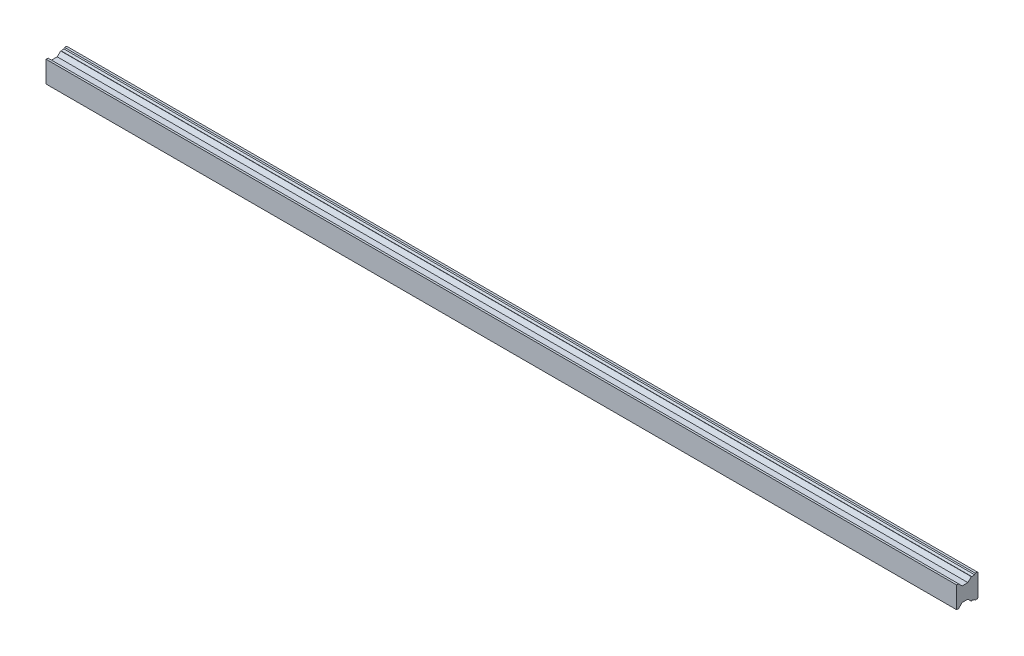
ISO-10303-21;
HEADER;
FILE_DESCRIPTION(('STEP AP214'),'2;1');
FILE_NAME('part.step','',(''),(''),'','','');
FILE_SCHEMA(('AUTOMOTIVE_DESIGN { 1 0 10303 214 1 1 1 1 }'));
ENDSEC;
DATA;
#1=APPLICATION_CONTEXT('core data for automotive mechanical design processes');
#2=APPLICATION_PROTOCOL_DEFINITION('international standard','automotive_design',2000,#1);
#3=PRODUCT_CONTEXT('',#1,'mechanical');
#4=PRODUCT('Part','Part','',(#3));
#5=PRODUCT_RELATED_PRODUCT_CATEGORY('part','',(#4));
#6=PRODUCT_DEFINITION_FORMATION('','',#4);
#7=PRODUCT_DEFINITION_CONTEXT('part definition',#1,'design');
#8=PRODUCT_DEFINITION('design','',#6,#7);
#9=PRODUCT_DEFINITION_SHAPE('','',#8);
#10=(LENGTH_UNIT() NAMED_UNIT(*) SI_UNIT(.MILLI.,.METRE.));
#11=(NAMED_UNIT(*) PLANE_ANGLE_UNIT() SI_UNIT($,.RADIAN.));
#12=(NAMED_UNIT(*) SI_UNIT($,.STERADIAN.) SOLID_ANGLE_UNIT());
#13=UNCERTAINTY_MEASURE_WITH_UNIT(LENGTH_MEASURE(1.E-05),#10,'distance_accuracy_value','');
#14=(GEOMETRIC_REPRESENTATION_CONTEXT(3) GLOBAL_UNCERTAINTY_ASSIGNED_CONTEXT((#13)) GLOBAL_UNIT_ASSIGNED_CONTEXT((#10,
#11,#12)) REPRESENTATION_CONTEXT('',''));
#15=CARTESIAN_POINT('',(0.,0.,0.));
#16=DIRECTION('',(0.,0.,1.));
#17=DIRECTION('',(1.,0.,0.));
#18=AXIS2_PLACEMENT_3D('',#15,#16,#17);
#19=CARTESIAN_POINT('',(702.99957441218,902.9999820789,490.4997838149));
#20=DIRECTION('',(-1.,0.,0.));
#21=DIRECTION('',(0.,0.,1.));
#22=AXIS2_PLACEMENT_3D('',#19,#20,#21);
#23=PLANE('',#22);
#24=DIRECTION('',(0.,-0.707106781187552,0.707106781185543));
#25=VECTOR('',#24,1.);
#26=CARTESIAN_POINT('',(702.99957441218,903.9999820789,490.4997838149));
#27=LINE('',#26,#25);
#28=CARTESIAN_POINT('',(702.99957441218,903.9999820789,490.4997838149));
#29=VERTEX_POINT('',#28);
#30=CARTESIAN_POINT('',(702.99957441218,902.999982078899,491.499783814899));
#31=VERTEX_POINT('',#30);
#32=EDGE_CURVE('E277',#29,#31,#27,.T.);
#33=ORIENTED_EDGE('',*,*,#32,.F.);
#34=DIRECTION('',(0.,-1.,0.));
#35=VECTOR('',#34,1.);
#36=CARTESIAN_POINT('',(702.99957441218,935.9999820789,490.4997838149));
#37=LINE('',#36,#35);
#38=CARTESIAN_POINT('',(702.99957441218,935.999982078899,490.4997838149));
#39=VERTEX_POINT('',#38);
#40=EDGE_CURVE('E349',#39,#29,#37,.T.);
#41=ORIENTED_EDGE('',*,*,#40,.F.);
#42=DIRECTION('',(0.,-0.707106781187552,-0.707106781185543));
#43=VECTOR('',#42,1.);
#44=CARTESIAN_POINT('',(702.99957441218,936.9999820789,491.4997838149));
#45=LINE('',#44,#43);
#46=CARTESIAN_POINT('',(702.99957441218,936.999982078917,491.499783814917));
#47=VERTEX_POINT('',#46);
#48=EDGE_CURVE('E345',#47,#39,#45,.T.);
#49=ORIENTED_EDGE('',*,*,#48,.F.);
#50=DIRECTION('',(0.,0.,1.));
#51=VECTOR('',#50,1.);
#52=CARTESIAN_POINT('',(702.99957441218,936.999982078935,490.4997838149));
#53=LINE('',#52,#51);
#54=CARTESIAN_POINT('',(702.99957441218,936.999982078935,494.499783814904));
#55=VERTEX_POINT('',#54);
#56=EDGE_CURVE('E340',#47,#55,#53,.T.);
#57=ORIENTED_EDGE('',*,*,#56,.T.);
#58=DIRECTION('',(0.,-0.707106781186548,0.707106781186548));
#59=VECTOR('',#58,1.);
#60=CARTESIAN_POINT('',(702.99957441218,936.386982078934,495.112783814905));
#61=LINE('',#60,#59);
#62=CARTESIAN_POINT('',(702.99957441218,935.773982078907,495.725783814932));
#63=VERTEX_POINT('',#62);
#64=EDGE_CURVE('E338',#63,#55,#61,.F.);
#65=ORIENTED_EDGE('',*,*,#64,.F.);
#66=DIRECTION('',(0.,0.258778081910201,-0.965936801412431));
#67=VECTOR('',#66,1.);
#68=CARTESIAN_POINT('',(702.99957441218,934.8499820789,499.1747838149));
#69=LINE('',#68,#67);
#70=CARTESIAN_POINT('',(702.99957441218,934.849982078902,499.174783814891));
#71=VERTEX_POINT('',#70);
#72=EDGE_CURVE('E333',#71,#63,#69,.T.);
#73=ORIENTED_EDGE('',*,*,#72,.F.);
#74=DIRECTION('',(0.,-0.707106781186548,-0.707106781186548));
#75=VECTOR('',#74,1.);
#76=CARTESIAN_POINT('',(702.99957441218,935.499982078933,499.82478381491));
#77=LINE('',#76,#75);
#78=CARTESIAN_POINT('',(702.99957441218,935.499982078933,499.82478381491));
#79=VERTEX_POINT('',#78);
#80=EDGE_CURVE('E328',#71,#79,#77,.F.);
#81=ORIENTED_EDGE('',*,*,#80,.T.);
#82=DIRECTION('',(0.,0.,1.));
#83=VECTOR('',#82,1.);
#84=CARTESIAN_POINT('',(702.99957441218,935.499982078933,500.04528381491));
#85=LINE('',#84,#83);
#86=CARTESIAN_POINT('',(702.99957441218,935.499982078933,500.265783814891));
#87=VERTEX_POINT('',#86);
#88=EDGE_CURVE('E326',#87,#79,#85,.F.);
#89=ORIENTED_EDGE('',*,*,#88,.F.);
#90=DIRECTION('',(0.,0.707106781187552,-0.707106781185543));
#91=VECTOR('',#90,1.);
#92=CARTESIAN_POINT('',(702.99957441218,930.4999820789,505.2657838149));
#93=LINE('',#92,#91);
#94=CARTESIAN_POINT('',(702.99957441218,930.499982078914,505.265783814886));
#95=VERTEX_POINT('',#94);
#96=EDGE_CURVE('E323',#95,#87,#93,.T.);
#97=ORIENTED_EDGE('',*,*,#96,.F.);
#98=DIRECTION('',(0.,0.,1.));
#99=VECTOR('',#98,1.);
#100=CARTESIAN_POINT('',(702.99957441218,930.499982078928,509.420283814919));
#101=LINE('',#100,#99);
#102=CARTESIAN_POINT('',(702.99957441218,930.499982078928,513.574783814922));
#103=VERTEX_POINT('',#102);
#104=EDGE_CURVE('E320',#103,#95,#101,.F.);
#105=ORIENTED_EDGE('',*,*,#104,.F.);
#106=DIRECTION('',(0.,-0.707106781187552,-0.707106781185543));
#107=VECTOR('',#106,1.);
#108=CARTESIAN_POINT('',(702.99957441218,935.4999820789,518.5747838149));
#109=LINE('',#108,#107);
#110=CARTESIAN_POINT('',(702.99957441218,935.4999820789,518.5747838149));
#111=VERTEX_POINT('',#110);
#112=EDGE_CURVE('E317',#111,#103,#109,.T.);
#113=ORIENTED_EDGE('',*,*,#112,.F.);
#114=DIRECTION('',(0.,-0.0590702266116563,-0.998253829608506));
#115=VECTOR('',#114,1.);
#116=CARTESIAN_POINT('',(702.99957441218,935.6789820789,521.5997838149));
#117=LINE('',#116,#115);
#118=CARTESIAN_POINT('',(702.99957441218,935.6789820789,521.5997838149));
#119=VERTEX_POINT('',#118);
#120=EDGE_CURVE('E314',#119,#111,#117,.T.);
#121=ORIENTED_EDGE('',*,*,#120,.F.);
#122=DIRECTION('',(0.,1.,0.));
#123=VECTOR('',#122,1.);
#124=CARTESIAN_POINT('',(702.99957441218,904.3209820789,521.5997838149));
#125=LINE('',#124,#123);
#126=CARTESIAN_POINT('',(702.99957441218,904.3209820789,521.5997838149));
#127=VERTEX_POINT('',#126);
#128=EDGE_CURVE('E311',#127,#119,#125,.T.);
#129=ORIENTED_EDGE('',*,*,#128,.F.);
#130=DIRECTION('',(0.,-0.0590702266116561,0.998253829608506));
#131=VECTOR('',#130,1.);
#132=CARTESIAN_POINT('',(702.99957441218,904.4999820789,518.5747838149));
#133=LINE('',#132,#131);
#134=CARTESIAN_POINT('',(702.99957441218,904.4999820789,518.574783814893));
#135=VERTEX_POINT('',#134);
#136=EDGE_CURVE('E308',#135,#127,#133,.T.);
#137=ORIENTED_EDGE('',*,*,#136,.F.);
#138=DIRECTION('',(0.,-0.707106781187552,0.707106781185543));
#139=VECTOR('',#138,1.);
#140=CARTESIAN_POINT('',(702.99957441218,909.4999820789,513.5747838149));
#141=LINE('',#140,#139);
#142=CARTESIAN_POINT('',(702.99957441218,909.4999820789,513.5747838149));
#143=VERTEX_POINT('',#142);
#144=EDGE_CURVE('E305',#143,#135,#141,.T.);
#145=ORIENTED_EDGE('',*,*,#144,.F.);
#146=DIRECTION('',(0.,0.,1.));
#147=VECTOR('',#146,1.);
#148=CARTESIAN_POINT('',(702.99957441218,909.4999820789,505.2657838149));
#149=LINE('',#148,#147);
#150=CARTESIAN_POINT('',(702.99957441218,909.4999820789,505.265783814893));
#151=VERTEX_POINT('',#150);
#152=EDGE_CURVE('E302',#151,#143,#149,.T.);
#153=ORIENTED_EDGE('',*,*,#152,.F.);
#154=DIRECTION('',(0.,0.707106781187552,0.707106781185543));
#155=VECTOR('',#154,1.);
#156=CARTESIAN_POINT('',(702.99957441218,904.4999820789,500.2657838149));
#157=LINE('',#156,#155);
#158=CARTESIAN_POINT('',(702.99957441218,904.499982078901,500.265783814901));
#159=VERTEX_POINT('',#158);
#160=EDGE_CURVE('E297',#159,#151,#157,.T.);
#161=ORIENTED_EDGE('',*,*,#160,.F.);
#162=DIRECTION('',(0.,0.,1.));
#163=VECTOR('',#162,1.);
#164=CARTESIAN_POINT('',(702.99957441218,904.499982078902,500.04528381491));
#165=LINE('',#164,#163);
#166=CARTESIAN_POINT('',(702.99957441218,904.499982078901,499.82478381491));
#167=VERTEX_POINT('',#166);
#168=EDGE_CURVE('E293',#167,#159,#165,.T.);
#169=ORIENTED_EDGE('',*,*,#168,.F.);
#170=DIRECTION('',(0.,-0.707106781186548,0.707106781186548));
#171=VECTOR('',#170,1.);
#172=CARTESIAN_POINT('',(702.99957441218,905.149982078902,499.174783814909));
#173=LINE('',#172,#171);
#174=CARTESIAN_POINT('',(702.99957441218,905.149982078905,499.174783814905));
#175=VERTEX_POINT('',#174);
#176=EDGE_CURVE('E189',#167,#175,#173,.F.);
#177=ORIENTED_EDGE('',*,*,#176,.T.);
#178=DIRECTION('',(0.,0.258778081910201,0.965936801412431));
#179=VECTOR('',#178,1.);
#180=CARTESIAN_POINT('',(702.99957441218,904.2259820789,495.7257838149));
#181=LINE('',#180,#179);
#182=CARTESIAN_POINT('',(702.99957441218,904.225982078901,495.725783814903));
#183=VERTEX_POINT('',#182);
#184=EDGE_CURVE('E287',#183,#175,#181,.T.);
#185=ORIENTED_EDGE('',*,*,#184,.F.);
#186=DIRECTION('',(0.,-0.707106781186548,-0.707106781186548));
#187=VECTOR('',#186,1.);
#188=CARTESIAN_POINT('',(702.99957441218,903.612982078901,495.112783814905));
#189=LINE('',#188,#187);
#190=CARTESIAN_POINT('',(702.99957441218,902.9999820789,494.499783814904));
#191=VERTEX_POINT('',#190);
#192=EDGE_CURVE('E282',#191,#183,#189,.F.);
#193=ORIENTED_EDGE('',*,*,#192,.F.);
#194=DIRECTION('',(0.,0.,1.));
#195=VECTOR('',#194,1.);
#196=CARTESIAN_POINT('',(702.99957441218,902.9999820789,490.4997838149));
#197=LINE('',#196,#195);
#198=EDGE_CURVE('E279',#191,#31,#197,.F.);
#199=ORIENTED_EDGE('',*,*,#198,.T.);
#200=EDGE_LOOP('',(#33,#41,#49,#57,#65,#73,#81,#89,#97,#105,#113,#121,#129,#137,#145,#153,#161,
#169,#177,#185,#193,#199));
#201=FACE_BOUND('',#200,.T.);
#202=ADVANCED_FACE('F17',(#201),#23,.F.);
#203=CARTESIAN_POINT('',(30.99957441218,903.612982078901,495.112783814905));
#204=DIRECTION('',(0.,-0.707106781186548,0.707106781186548));
#205=DIRECTION('',(0.,-0.707106781186548,-0.707106781186548));
#206=AXIS2_PLACEMENT_3D('',#203,#204,#205);
#207=PLANE('',#206);
#208=DIRECTION('',(1.,0.,0.));
#209=VECTOR('',#208,1.);
#210=CARTESIAN_POINT('',(30.99957441218,902.9999820789,494.499783814904));
#211=LINE('',#210,#209);
#212=CARTESIAN_POINT('',(-625.00042558782,902.9999820789,494.499783814904));
#213=VERTEX_POINT('',#212);
#214=CARTESIAN_POINT('',(686.99957441218,902.9999820789,494.499783814904));
#215=VERTEX_POINT('',#214);
#216=EDGE_CURVE('E458',#213,#215,#211,.T.);
#217=ORIENTED_EDGE('',*,*,#216,.T.);
#218=CARTESIAN_POINT('',(686.999574412181,902.9999820789,494.499783814904));
#219=DIRECTION('',(1.,0.,0.));
#220=VECTOR('',#219,1.);
#221=LINE('',#218,#220);
#222=EDGE_CURVE('E194',#215,#191,#221,.T.);
#223=ORIENTED_EDGE('',*,*,#222,.T.);
#224=ORIENTED_EDGE('',*,*,#192,.T.);
#225=DIRECTION('',(-1.,0.,0.));
#226=VECTOR('',#225,1.);
#227=CARTESIAN_POINT('',(686.99957441218,904.2259820789,495.7257838149));
#228=LINE('',#227,#226);
#229=CARTESIAN_POINT('',(-625.00042558782,904.2259820789,495.725783814903));
#230=VERTEX_POINT('',#229);
#231=EDGE_CURVE('E206',#230,#183,#228,.F.);
#232=ORIENTED_EDGE('',*,*,#231,.F.);
#233=DIRECTION('',(0.,0.707106781186548,0.707106781186548));
#234=VECTOR('',#233,1.);
#235=CARTESIAN_POINT('',(-625.00042558782,902.9999820789,494.499783814904));
#236=LINE('',#235,#234);
#237=EDGE_CURVE('E260',#213,#230,#236,.T.);
#238=ORIENTED_EDGE('',*,*,#237,.F.);
#239=EDGE_LOOP('',(#217,#223,#224,#232,#238));
#240=FACE_BOUND('',#239,.T.);
#241=ADVANCED_FACE('F433',(#240),#207,.T.);
#242=CARTESIAN_POINT('',(686.99957441218,904.2259820789,495.7257838149));
#243=DIRECTION('',(0.,-0.965936801412431,0.258778081910201));
#244=DIRECTION('',(0.,0.258778081910201,0.965936801412431));
#245=AXIS2_PLACEMENT_3D('',#242,#243,#244);
#246=PLANE('',#245);
#247=ORIENTED_EDGE('',*,*,#231,.T.);
#248=ORIENTED_EDGE('',*,*,#184,.T.);
#249=DIRECTION('',(-1.,0.,0.));
#250=VECTOR('',#249,1.);
#251=CARTESIAN_POINT('',(686.99957441218,905.149982078904,499.174783814904));
#252=LINE('',#251,#250);
#253=CARTESIAN_POINT('',(-625.00042558782,905.149982078904,499.174783814907));
#254=VERTEX_POINT('',#253);
#255=EDGE_CURVE('E202',#175,#254,#252,.T.);
#256=ORIENTED_EDGE('',*,*,#255,.T.);
#257=DIRECTION('',(0.,0.258778081909355,0.965936801412657));
#258=VECTOR('',#257,1.);
#259=CARTESIAN_POINT('',(-625.00042558782,904.225982078901,495.725783814905));
#260=LINE('',#259,#258);
#261=EDGE_CURVE('E256',#230,#254,#260,.T.);
#262=ORIENTED_EDGE('',*,*,#261,.F.);
#263=EDGE_LOOP('',(#247,#248,#256,#262));
#264=FACE_BOUND('',#263,.T.);
#265=ADVANCED_FACE('F432',(#264),#246,.T.);
#266=CARTESIAN_POINT('',(30.99957441218,904.824982078902,499.499783814909));
#267=DIRECTION('',(0.,0.707106781186548,0.707106781186548));
#268=DIRECTION('',(0.,-0.707106781186548,0.707106781186548));
#269=AXIS2_PLACEMENT_3D('',#266,#267,#268);
#270=PLANE('',#269);
#271=DIRECTION('',(0.,-0.707106781186548,0.707106781186548));
#272=VECTOR('',#271,1.);
#273=CARTESIAN_POINT('',(-625.00042558782,905.149982078902,499.174783814909));
#274=LINE('',#273,#272);
#275=CARTESIAN_POINT('',(-625.00042558782,904.499982078902,499.82478381491));
#276=VERTEX_POINT('',#275);
#277=EDGE_CURVE('E259',#254,#276,#274,.T.);
#278=ORIENTED_EDGE('',*,*,#277,.F.);
#279=ORIENTED_EDGE('',*,*,#255,.F.);
#280=ORIENTED_EDGE('',*,*,#176,.F.);
#281=CARTESIAN_POINT('',(686.99957441218,904.499982078902,499.82478381491));
#282=DIRECTION('',(1.,0.,0.));
#283=VECTOR('',#282,1.);
#284=LINE('',#281,#283);
#285=CARTESIAN_POINT('',(686.99957441218,904.499982078901,499.82478381491));
#286=VERTEX_POINT('',#285);
#287=EDGE_CURVE('E181',#286,#167,#284,.T.);
#288=ORIENTED_EDGE('',*,*,#287,.F.);
#289=DIRECTION('',(1.,0.,0.));
#290=VECTOR('',#289,1.);
#291=CARTESIAN_POINT('',(30.99957441218,904.499982078902,499.82478381491));
#292=LINE('',#291,#290);
#293=EDGE_CURVE('E186',#276,#286,#292,.T.);
#294=ORIENTED_EDGE('',*,*,#293,.F.);
#295=EDGE_LOOP('',(#278,#279,#280,#288,#294));
#296=FACE_BOUND('',#295,.T.);
#297=ADVANCED_FACE('F185',(#296),#270,.F.);
#298=CARTESIAN_POINT('',(30.99957441218,904.499982078902,500.04528381491));
#299=DIRECTION('',(0.,-1.,0.));
#300=DIRECTION('',(1.,0.,0.));
#301=AXIS2_PLACEMENT_3D('',#298,#299,#300);
#302=PLANE('',#301);
#303=ORIENTED_EDGE('',*,*,#293,.T.);
#304=ORIENTED_EDGE('',*,*,#287,.T.);
#305=ORIENTED_EDGE('',*,*,#168,.T.);
#306=DIRECTION('',(-1.,0.,0.));
#307=VECTOR('',#306,1.);
#308=CARTESIAN_POINT('',(686.99957441218,904.4999820789,500.2657838149));
#309=LINE('',#308,#307);
#310=CARTESIAN_POINT('',(-625.00042558782,904.499982078901,500.265783814905));
#311=VERTEX_POINT('',#310);
#312=EDGE_CURVE('E201',#311,#159,#309,.F.);
#313=ORIENTED_EDGE('',*,*,#312,.F.);
#314=DIRECTION('',(0.,0.,1.));
#315=VECTOR('',#314,1.);
#316=CARTESIAN_POINT('',(-625.00042558782,904.499982078902,490.4997838149));
#317=LINE('',#316,#315);
#318=EDGE_CURVE('E199',#276,#311,#317,.T.);
#319=ORIENTED_EDGE('',*,*,#318,.F.);
#320=EDGE_LOOP('',(#303,#304,#305,#313,#319));
#321=FACE_BOUND('',#320,.T.);
#322=ADVANCED_FACE('F197',(#321),#302,.T.);
#323=CARTESIAN_POINT('',(686.99957441218,904.4999820789,500.2657838149));
#324=DIRECTION('',(0.,-0.707106781185543,0.707106781187552));
#325=DIRECTION('',(0.,0.707106781187552,0.707106781185543));
#326=AXIS2_PLACEMENT_3D('',#323,#324,#325);
#327=PLANE('',#326);
#328=ORIENTED_EDGE('',*,*,#312,.T.);
#329=ORIENTED_EDGE('',*,*,#160,.T.);
#330=DIRECTION('',(-1.,0.,0.));
#331=VECTOR('',#330,1.);
#332=CARTESIAN_POINT('',(686.99957441218,909.4999820789,505.2657838149));
#333=LINE('',#332,#331);
#334=CARTESIAN_POINT('',(-625.00042558782,909.499982078902,505.265783814908));
#335=VERTEX_POINT('',#334);
#336=EDGE_CURVE('E204',#335,#151,#333,.F.);
#337=ORIENTED_EDGE('',*,*,#336,.F.);
#338=DIRECTION('',(0.,0.707106781186556,0.70710678118654));
#339=VECTOR('',#338,1.);
#340=CARTESIAN_POINT('',(-625.00042558782,904.499982078902,500.26578381491));
#341=LINE('',#340,#339);
#342=EDGE_CURVE('E253',#311,#335,#341,.T.);
#343=ORIENTED_EDGE('',*,*,#342,.F.);
#344=EDGE_LOOP('',(#328,#329,#337,#343));
#345=FACE_BOUND('',#344,.T.);
#346=ADVANCED_FACE('F421',(#345),#327,.T.);
#347=CARTESIAN_POINT('',(686.99957441218,909.4999820789,505.2657838149));
#348=DIRECTION('',(0.,-1.,0.));
#349=DIRECTION('',(0.,0.,1.));
#350=AXIS2_PLACEMENT_3D('',#347,#348,#349);
#351=PLANE('',#350);
#352=ORIENTED_EDGE('',*,*,#336,.T.);
#353=ORIENTED_EDGE('',*,*,#152,.T.);
#354=DIRECTION('',(-1.,0.,0.));
#355=VECTOR('',#354,1.);
#356=CARTESIAN_POINT('',(686.99957441218,909.4999820789,513.5747838149));
#357=LINE('',#356,#355);
#358=CARTESIAN_POINT('',(-625.00042558782,909.499982078905,513.574783814912));
#359=VERTEX_POINT('',#358);
#360=EDGE_CURVE('E274',#359,#143,#357,.F.);
#361=ORIENTED_EDGE('',*,*,#360,.F.);
#362=DIRECTION('',(0.,0.,1.));
#363=VECTOR('',#362,1.);
#364=CARTESIAN_POINT('',(-625.00042558782,909.499982078907,490.4997838149));
#365=LINE('',#364,#363);
#366=EDGE_CURVE('E250',#335,#359,#365,.T.);
#367=ORIENTED_EDGE('',*,*,#366,.F.);
#368=EDGE_LOOP('',(#352,#353,#361,#367));
#369=FACE_BOUND('',#368,.T.);
#370=ADVANCED_FACE('F673',(#369),#351,.T.);
#371=CARTESIAN_POINT('',(686.99957441218,909.4999820789,513.5747838149));
#372=DIRECTION('',(0.,-0.707106781185543,-0.707106781187552));
#373=DIRECTION('',(0.,-0.707106781187552,0.707106781185543));
#374=AXIS2_PLACEMENT_3D('',#371,#372,#373);
#375=PLANE('',#374);
#376=ORIENTED_EDGE('',*,*,#360,.T.);
#377=ORIENTED_EDGE('',*,*,#144,.T.);
#378=DIRECTION('',(-1.,0.,0.));
#379=VECTOR('',#378,1.);
#380=CARTESIAN_POINT('',(686.99957441218,904.4999820789,518.5747838149));
#381=LINE('',#380,#379);
#382=CARTESIAN_POINT('',(-625.00042558782,904.499982078902,518.574783814915));
#383=VERTEX_POINT('',#382);
#384=EDGE_CURVE('E272',#383,#135,#381,.F.);
#385=ORIENTED_EDGE('',*,*,#384,.F.);
#386=DIRECTION('',(0.,-0.70710678118654,0.707106781186556));
#387=VECTOR('',#386,1.);
#388=CARTESIAN_POINT('',(-625.00042558782,909.499982078907,513.574783814924));
#389=LINE('',#388,#387);
#390=EDGE_CURVE('E247',#359,#383,#389,.T.);
#391=ORIENTED_EDGE('',*,*,#390,.F.);
#392=EDGE_LOOP('',(#376,#377,#385,#391));
#393=FACE_BOUND('',#392,.T.);
#394=ADVANCED_FACE('F663',(#393),#375,.T.);
#395=CARTESIAN_POINT('',(686.99957441218,904.4999820789,518.5747838149));
#396=DIRECTION('',(0.,-0.998253829608506,-0.0590702266116561));
#397=DIRECTION('',(0.,-0.0590702266116561,0.998253829608506));
#398=AXIS2_PLACEMENT_3D('',#395,#396,#397);
#399=PLANE('',#398);
#400=ORIENTED_EDGE('',*,*,#384,.T.);
#401=ORIENTED_EDGE('',*,*,#136,.T.);
#402=DIRECTION('',(-1.,0.,0.));
#403=VECTOR('',#402,1.);
#404=CARTESIAN_POINT('',(686.99957441218,904.3209820789,521.5997838149));
#405=LINE('',#404,#403);
#406=CARTESIAN_POINT('',(-625.00042558782,904.320982078902,521.599783814916));
#407=VERTEX_POINT('',#406);
#408=EDGE_CURVE('E270',#407,#127,#405,.F.);
#409=ORIENTED_EDGE('',*,*,#408,.F.);
#410=DIRECTION('',(0.,-0.0590702266115375,0.998253829608513));
#411=VECTOR('',#410,1.);
#412=CARTESIAN_POINT('',(-625.00042558782,904.499982078902,518.574783814929));
#413=LINE('',#412,#411);
#414=EDGE_CURVE('E244',#383,#407,#413,.T.);
#415=ORIENTED_EDGE('',*,*,#414,.F.);
#416=EDGE_LOOP('',(#400,#401,#409,#415));
#417=FACE_BOUND('',#416,.T.);
#418=ADVANCED_FACE('F653',(#417),#399,.T.);
#419=CARTESIAN_POINT('',(686.99957441218,904.3209820789,521.5997838149));
#420=DIRECTION('',(0.,0.,1.));
#421=DIRECTION('',(0.,1.,0.));
#422=AXIS2_PLACEMENT_3D('',#419,#420,#421);
#423=PLANE('',#422);
#424=ORIENTED_EDGE('',*,*,#408,.T.);
#425=ORIENTED_EDGE('',*,*,#128,.T.);
#426=DIRECTION('',(-1.,0.,0.));
#427=VECTOR('',#426,1.);
#428=CARTESIAN_POINT('',(686.99957441218,935.6789820789,521.5997838149));
#429=LINE('',#428,#427);
#430=CARTESIAN_POINT('',(-625.00042558782,935.678982078925,521.599783814915));
#431=VERTEX_POINT('',#430);
#432=EDGE_CURVE('E268',#431,#119,#429,.F.);
#433=ORIENTED_EDGE('',*,*,#432,.F.);
#434=DIRECTION('',(0.,1.,0.));
#435=VECTOR('',#434,1.);
#436=CARTESIAN_POINT('',(-625.00042558782,902.9999820789,521.599783814932));
#437=LINE('',#436,#435);
#438=EDGE_CURVE('E241',#407,#431,#437,.T.);
#439=ORIENTED_EDGE('',*,*,#438,.F.);
#440=EDGE_LOOP('',(#424,#425,#433,#439));
#441=FACE_BOUND('',#440,.T.);
#442=ADVANCED_FACE('F643',(#441),#423,.T.);
#443=CARTESIAN_POINT('',(686.99957441218,935.6789820789,521.5997838149));
#444=DIRECTION('',(0.,0.998253829608506,-0.0590702266116563));
#445=DIRECTION('',(0.,-0.0590702266116563,-0.998253829608506));
#446=AXIS2_PLACEMENT_3D('',#443,#444,#445);
#447=PLANE('',#446);
#448=ORIENTED_EDGE('',*,*,#432,.T.);
#449=ORIENTED_EDGE('',*,*,#120,.T.);
#450=DIRECTION('',(-1.,0.,0.));
#451=VECTOR('',#450,1.);
#452=CARTESIAN_POINT('',(686.99957441218,935.4999820789,518.5747838149));
#453=LINE('',#452,#451);
#454=CARTESIAN_POINT('',(-625.00042558782,935.499982078917,518.574783814914));
#455=VERTEX_POINT('',#454);
#456=EDGE_CURVE('E265',#455,#111,#453,.F.);
#457=ORIENTED_EDGE('',*,*,#456,.F.);
#458=DIRECTION('',(0.,-0.0590702266115376,-0.998253829608513));
#459=VECTOR('',#458,1.);
#460=CARTESIAN_POINT('',(-625.00042558782,935.678982078934,521.599783814932));
#461=LINE('',#460,#459);
#462=EDGE_CURVE('E238',#431,#455,#461,.T.);
#463=ORIENTED_EDGE('',*,*,#462,.F.);
#464=EDGE_LOOP('',(#448,#449,#457,#463));
#465=FACE_BOUND('',#464,.T.);
#466=ADVANCED_FACE('F633',(#465),#447,.T.);
#467=CARTESIAN_POINT('',(686.99957441218,935.4999820789,518.5747838149));
#468=DIRECTION('',(0.,0.707106781185543,-0.707106781187552));
#469=DIRECTION('',(0.,-0.707106781187552,-0.707106781185543));
#470=AXIS2_PLACEMENT_3D('',#467,#468,#469);
#471=PLANE('',#470);
#472=ORIENTED_EDGE('',*,*,#456,.T.);
#473=ORIENTED_EDGE('',*,*,#112,.T.);
#474=DIRECTION('',(-1.,0.,0.));
#475=VECTOR('',#474,1.);
#476=CARTESIAN_POINT('',(30.99957441218,930.499982078928,513.574783814901));
#477=LINE('',#476,#475);
#478=CARTESIAN_POINT('',(-625.00042558782,930.499982078928,513.574783814913));
#479=VERTEX_POINT('',#478);
#480=EDGE_CURVE('E267',#479,#103,#477,.F.);
#481=ORIENTED_EDGE('',*,*,#480,.F.);
#482=DIRECTION('',(0.,-0.70710678118654,-0.707106781186556));
#483=VECTOR('',#482,1.);
#484=CARTESIAN_POINT('',(-625.00042558782,935.499982078933,518.574783814929));
#485=LINE('',#484,#483);
#486=EDGE_CURVE('E235',#455,#479,#485,.T.);
#487=ORIENTED_EDGE('',*,*,#486,.F.);
#488=EDGE_LOOP('',(#472,#473,#481,#487));
#489=FACE_BOUND('',#488,.T.);
#490=ADVANCED_FACE('F416',(#489),#471,.T.);
#491=CARTESIAN_POINT('',(30.99957441218,930.499982078928,509.420283814919));
#492=DIRECTION('',(0.,1.,0.));
#493=DIRECTION('',(-1.,0.,0.));
#494=AXIS2_PLACEMENT_3D('',#491,#492,#493);
#495=PLANE('',#494);
#496=ORIENTED_EDGE('',*,*,#480,.T.);
#497=ORIENTED_EDGE('',*,*,#104,.T.);
#498=DIRECTION('',(-1.,0.,0.));
#499=VECTOR('',#498,1.);
#500=CARTESIAN_POINT('',(686.99957441218,930.4999820789,505.2657838149));
#501=LINE('',#500,#499);
#502=CARTESIAN_POINT('',(-625.00042558782,930.499982078921,505.265783814907));
#503=VERTEX_POINT('',#502);
#504=EDGE_CURVE('E479',#503,#95,#501,.F.);
#505=ORIENTED_EDGE('',*,*,#504,.F.);
#506=DIRECTION('',(0.,0.,1.));
#507=VECTOR('',#506,1.);
#508=CARTESIAN_POINT('',(-625.00042558782,930.499982078928,490.4997838149));
#509=LINE('',#508,#507);
#510=EDGE_CURVE('E234',#479,#503,#509,.F.);
#511=ORIENTED_EDGE('',*,*,#510,.F.);
#512=EDGE_LOOP('',(#496,#497,#505,#511));
#513=FACE_BOUND('',#512,.T.);
#514=ADVANCED_FACE('F413',(#513),#495,.T.);
#515=CARTESIAN_POINT('',(686.99957441218,930.4999820789,505.2657838149));
#516=DIRECTION('',(0.,0.707106781185543,0.707106781187552));
#517=DIRECTION('',(0.,0.707106781187552,-0.707106781185543));
#518=AXIS2_PLACEMENT_3D('',#515,#516,#517);
#519=PLANE('',#518);
#520=ORIENTED_EDGE('',*,*,#504,.T.);
#521=ORIENTED_EDGE('',*,*,#96,.T.);
#522=DIRECTION('',(-1.,0.,0.));
#523=VECTOR('',#522,1.);
#524=CARTESIAN_POINT('',(30.99957441218,935.499982078933,500.265783814901));
#525=LINE('',#524,#523);
#526=CARTESIAN_POINT('',(-625.00042558782,935.499982078933,500.265783814905));
#527=VERTEX_POINT('',#526);
#528=EDGE_CURVE('E475',#527,#87,#525,.F.);
#529=ORIENTED_EDGE('',*,*,#528,.F.);
#530=DIRECTION('',(0.,0.707106781186556,-0.70710678118654));
#531=VECTOR('',#530,1.);
#532=CARTESIAN_POINT('',(-625.00042558782,930.499982078928,505.265783814915));
#533=LINE('',#532,#531);
#534=EDGE_CURVE('E230',#503,#527,#533,.T.);
#535=ORIENTED_EDGE('',*,*,#534,.F.);
#536=EDGE_LOOP('',(#520,#521,#529,#535));
#537=FACE_BOUND('',#536,.T.);
#538=ADVANCED_FACE('F412',(#537),#519,.T.);
#539=CARTESIAN_POINT('',(30.99957441218,935.499982078933,500.04528381491));
#540=DIRECTION('',(0.,1.,0.));
#541=DIRECTION('',(-1.,0.,0.));
#542=AXIS2_PLACEMENT_3D('',#539,#540,#541);
#543=PLANE('',#542);
#544=ORIENTED_EDGE('',*,*,#528,.T.);
#545=ORIENTED_EDGE('',*,*,#88,.T.);
#546=CARTESIAN_POINT('',(686.999574412181,935.499982078933,499.824783814909));
#547=DIRECTION('',(1.,0.,0.));
#548=VECTOR('',#547,1.);
#549=LINE('',#546,#548);
#550=CARTESIAN_POINT('',(686.99957441218,935.499982078933,499.82478381491));
#551=VERTEX_POINT('',#550);
#552=EDGE_CURVE('E28',#551,#79,#549,.T.);
#553=ORIENTED_EDGE('',*,*,#552,.F.);
#554=DIRECTION('',(-1.,0.,0.));
#555=VECTOR('',#554,1.);
#556=CARTESIAN_POINT('',(30.99957441218,935.499982078933,499.82478381491));
#557=LINE('',#556,#555);
#558=CARTESIAN_POINT('',(-625.00042558782,935.499982078933,499.82478381491));
#559=VERTEX_POINT('',#558);
#560=EDGE_CURVE('E473',#551,#559,#557,.T.);
#561=ORIENTED_EDGE('',*,*,#560,.T.);
#562=DIRECTION('',(0.,0.,1.));
#563=VECTOR('',#562,1.);
#564=CARTESIAN_POINT('',(-625.00042558782,935.499982078933,490.4997838149));
#565=LINE('',#564,#563);
#566=EDGE_CURVE('E233',#527,#559,#565,.F.);
#567=ORIENTED_EDGE('',*,*,#566,.F.);
#568=EDGE_LOOP('',(#544,#545,#553,#561,#567));
#569=FACE_BOUND('',#568,.T.);
#570=ADVANCED_FACE('F403',(#569),#543,.T.);
#571=CARTESIAN_POINT('',(30.99957441218,935.174982078933,499.499783814909));
#572=DIRECTION('',(0.,-0.707106781186548,0.707106781186548));
#573=DIRECTION('',(0.,-0.707106781186548,-0.707106781186548));
#574=AXIS2_PLACEMENT_3D('',#571,#572,#573);
#575=PLANE('',#574);
#576=DIRECTION('',(0.,-0.707106781186548,-0.707106781186548));
#577=VECTOR('',#576,1.);
#578=CARTESIAN_POINT('',(-625.00042558782,935.499982078933,499.82478381491));
#579=LINE('',#578,#577);
#580=CARTESIAN_POINT('',(-625.00042558782,934.849982078919,499.174783814901));
#581=VERTEX_POINT('',#580);
#582=EDGE_CURVE('E229',#559,#581,#579,.T.);
#583=ORIENTED_EDGE('',*,*,#582,.F.);
#584=ORIENTED_EDGE('',*,*,#560,.F.);
#585=ORIENTED_EDGE('',*,*,#552,.T.);
#586=ORIENTED_EDGE('',*,*,#80,.F.);
#587=DIRECTION('',(-1.,0.,0.));
#588=VECTOR('',#587,1.);
#589=CARTESIAN_POINT('',(686.99957441218,934.8499820789,499.1747838149));
#590=LINE('',#589,#588);
#591=EDGE_CURVE('E474',#581,#71,#590,.F.);
#592=ORIENTED_EDGE('',*,*,#591,.F.);
#593=EDGE_LOOP('',(#583,#584,#585,#586,#592));
#594=FACE_BOUND('',#593,.T.);
#595=ADVANCED_FACE('F375',(#594),#575,.F.);
#596=CARTESIAN_POINT('',(686.99957441218,934.8499820789,499.1747838149));
#597=DIRECTION('',(0.,0.965936801412431,0.258778081910201));
#598=DIRECTION('',(0.,0.258778081910201,-0.965936801412431));
#599=AXIS2_PLACEMENT_3D('',#596,#597,#598);
#600=PLANE('',#599);
#601=ORIENTED_EDGE('',*,*,#591,.T.);
#602=ORIENTED_EDGE('',*,*,#72,.T.);
#603=DIRECTION('',(1.,0.,0.));
#604=VECTOR('',#603,1.);
#605=CARTESIAN_POINT('',(30.99957441218,935.773982078923,495.725783814916));
#606=LINE('',#605,#604);
#607=CARTESIAN_POINT('',(-625.00042558782,935.773982078929,495.72578381491));
#608=VERTEX_POINT('',#607);
#609=EDGE_CURVE('E471',#608,#63,#606,.T.);
#610=ORIENTED_EDGE('',*,*,#609,.F.);
#611=DIRECTION('',(0.,0.258778081909355,-0.965936801412657));
#612=VECTOR('',#611,1.);
#613=CARTESIAN_POINT('',(-625.00042558782,934.849982078933,499.174783814909));
#614=LINE('',#613,#612);
#615=EDGE_CURVE('E225',#581,#608,#614,.T.);
#616=ORIENTED_EDGE('',*,*,#615,.F.);
#617=EDGE_LOOP('',(#601,#602,#610,#616));
#618=FACE_BOUND('',#617,.T.);
#619=ADVANCED_FACE('F373',(#618),#600,.T.);
#620=CARTESIAN_POINT('',(30.99957441218,936.386982078934,495.112783814905));
#621=DIRECTION('',(0.,0.707106781186548,0.707106781186548));
#622=DIRECTION('',(0.,-0.707106781186548,0.707106781186548));
#623=AXIS2_PLACEMENT_3D('',#620,#621,#622);
#624=PLANE('',#623);
#625=ORIENTED_EDGE('',*,*,#609,.T.);
#626=ORIENTED_EDGE('',*,*,#64,.T.);
#627=CARTESIAN_POINT('',(686.99957441218,936.999982078935,494.499783814904));
#628=DIRECTION('',(1.,0.,0.));
#629=VECTOR('',#628,1.);
#630=LINE('',#627,#629);
#631=CARTESIAN_POINT('',(686.99957441218,936.999982078935,494.499783814904));
#632=VERTEX_POINT('',#631);
#633=EDGE_CURVE('E11',#632,#55,#630,.T.);
#634=ORIENTED_EDGE('',*,*,#633,.F.);
#635=DIRECTION('',(-1.,0.,0.));
#636=VECTOR('',#635,1.);
#637=CARTESIAN_POINT('',(30.99957441218,936.999982078935,494.499783814904));
#638=LINE('',#637,#636);
#639=CARTESIAN_POINT('',(-625.00042558782,936.999982078935,494.499783814904));
#640=VERTEX_POINT('',#639);
#641=EDGE_CURVE('E469',#632,#640,#638,.T.);
#642=ORIENTED_EDGE('',*,*,#641,.T.);
#643=DIRECTION('',(0.,0.707106781186548,-0.707106781186548));
#644=VECTOR('',#643,1.);
#645=CARTESIAN_POINT('',(-625.00042558782,935.773982078934,495.725783814905));
#646=LINE('',#645,#644);
#647=EDGE_CURVE('E228',#608,#640,#646,.T.);
#648=ORIENTED_EDGE('',*,*,#647,.F.);
#649=EDGE_LOOP('',(#625,#626,#634,#642,#648));
#650=FACE_BOUND('',#649,.T.);
#651=ADVANCED_FACE('F369',(#650),#624,.T.);
#652=CARTESIAN_POINT('',(30.99957441218,936.999982078935,492.999783814902));
#653=DIRECTION('',(0.,-1.,0.));
#654=DIRECTION('',(1.,0.,0.));
#655=AXIS2_PLACEMENT_3D('',#652,#653,#654);
#656=PLANE('',#655);
#657=DIRECTION('',(0.,0.,1.));
#658=VECTOR('',#657,1.);
#659=CARTESIAN_POINT('',(-625.00042558782,936.999982078935,490.4997838149));
#660=LINE('',#659,#658);
#661=CARTESIAN_POINT('',(-625.00042558782,936.999982078922,491.499783814896));
#662=VERTEX_POINT('',#661);
#663=EDGE_CURVE('E224',#640,#662,#660,.F.);
#664=ORIENTED_EDGE('',*,*,#663,.F.);
#665=ORIENTED_EDGE('',*,*,#641,.F.);
#666=ORIENTED_EDGE('',*,*,#633,.T.);
#667=ORIENTED_EDGE('',*,*,#56,.F.);
#668=DIRECTION('',(-1.,0.,0.));
#669=VECTOR('',#668,1.);
#670=CARTESIAN_POINT('',(686.99957441218,936.9999820789,491.4997838149));
#671=LINE('',#670,#669);
#672=EDGE_CURVE('E264',#662,#47,#671,.F.);
#673=ORIENTED_EDGE('',*,*,#672,.F.);
#674=EDGE_LOOP('',(#664,#665,#666,#667,#673));
#675=FACE_BOUND('',#674,.T.);
#676=ADVANCED_FACE('F359',(#675),#656,.F.);
#677=CARTESIAN_POINT('',(686.99957441218,936.9999820789,491.4997838149));
#678=DIRECTION('',(0.,0.707106781185543,-0.707106781187552));
#679=DIRECTION('',(0.,-0.707106781187552,-0.707106781185543));
#680=AXIS2_PLACEMENT_3D('',#677,#678,#679);
#681=PLANE('',#680);
#682=ORIENTED_EDGE('',*,*,#672,.T.);
#683=ORIENTED_EDGE('',*,*,#48,.T.);
#684=DIRECTION('',(-1.,0.,0.));
#685=VECTOR('',#684,1.);
#686=CARTESIAN_POINT('',(686.99957441218,935.9999820789,490.4997838149));
#687=LINE('',#686,#685);
#688=CARTESIAN_POINT('',(-625.00042558782,935.999982078917,490.4997838149));
#689=VERTEX_POINT('',#688);
#690=EDGE_CURVE('E42',#689,#39,#687,.F.);
#691=ORIENTED_EDGE('',*,*,#690,.F.);
#692=DIRECTION('',(0.,-0.707106781186469,-0.707106781186626));
#693=VECTOR('',#692,1.);
#694=CARTESIAN_POINT('',(-625.00042558782,936.999982078935,491.499783814901));
#695=LINE('',#694,#693);
#696=EDGE_CURVE('E221',#662,#689,#695,.T.);
#697=ORIENTED_EDGE('',*,*,#696,.F.);
#698=EDGE_LOOP('',(#682,#683,#691,#697));
#699=FACE_BOUND('',#698,.T.);
#700=ADVANCED_FACE('F368',(#699),#681,.T.);
#701=CARTESIAN_POINT('',(686.99957441218,935.9999820789,490.4997838149));
#702=DIRECTION('',(0.,0.,-1.));
#703=DIRECTION('',(0.,-1.,0.));
#704=AXIS2_PLACEMENT_3D('',#701,#702,#703);
#705=PLANE('',#704);
#706=ORIENTED_EDGE('',*,*,#690,.T.);
#707=ORIENTED_EDGE('',*,*,#40,.T.);
#708=DIRECTION('',(-1.,0.,0.));
#709=VECTOR('',#708,1.);
#710=CARTESIAN_POINT('',(686.99957441218,903.9999820789,490.4997838149));
#711=LINE('',#710,#709);
#712=CARTESIAN_POINT('',(-625.00042558782,903.9999820789,490.4997838149));
#713=VERTEX_POINT('',#712);
#714=EDGE_CURVE('E35',#713,#29,#711,.F.);
#715=ORIENTED_EDGE('',*,*,#714,.F.);
#716=DIRECTION('',(0.,1.,0.));
#717=VECTOR('',#716,1.);
#718=CARTESIAN_POINT('',(-625.00042558782,902.9999820789,490.4997838149));
#719=LINE('',#718,#717);
#720=EDGE_CURVE('E218',#689,#713,#719,.F.);
#721=ORIENTED_EDGE('',*,*,#720,.F.);
#722=EDGE_LOOP('',(#706,#707,#715,#721));
#723=FACE_BOUND('',#722,.T.);
#724=ADVANCED_FACE('F538',(#723),#705,.T.);
#725=CARTESIAN_POINT('',(686.99957441218,903.9999820789,490.4997838149));
#726=DIRECTION('',(0.,-0.707106781185543,-0.707106781187552));
#727=DIRECTION('',(0.,-0.707106781187552,0.707106781185543));
#728=AXIS2_PLACEMENT_3D('',#725,#726,#727);
#729=PLANE('',#728);
#730=ORIENTED_EDGE('',*,*,#714,.T.);
#731=ORIENTED_EDGE('',*,*,#32,.T.);
#732=DIRECTION('',(-1.,0.,0.));
#733=VECTOR('',#732,1.);
#734=CARTESIAN_POINT('',(686.99957441218,902.999982078897,491.4997838149));
#735=LINE('',#734,#733);
#736=CARTESIAN_POINT('',(-625.00042558782,902.999982078899,491.499783814901));
#737=VERTEX_POINT('',#736);
#738=EDGE_CURVE('E262',#31,#737,#735,.T.);
#739=ORIENTED_EDGE('',*,*,#738,.T.);
#740=DIRECTION('',(0.,-0.707106781186469,0.707106781186626));
#741=VECTOR('',#740,1.);
#742=CARTESIAN_POINT('',(-625.00042558782,903.999982078901,490.4997838149));
#743=LINE('',#742,#741);
#744=EDGE_CURVE('E214',#713,#737,#743,.T.);
#745=ORIENTED_EDGE('',*,*,#744,.F.);
#746=EDGE_LOOP('',(#730,#731,#739,#745));
#747=FACE_BOUND('',#746,.T.);
#748=ADVANCED_FACE('F504',(#747),#729,.T.);
#749=CARTESIAN_POINT('',(30.99957441218,902.9999820789,492.999783814902));
#750=DIRECTION('',(0.,1.,0.));
#751=DIRECTION('',(-1.,0.,0.));
#752=AXIS2_PLACEMENT_3D('',#749,#750,#751);
#753=PLANE('',#752);
#754=DIRECTION('',(0.,0.,1.));
#755=VECTOR('',#754,1.);
#756=CARTESIAN_POINT('',(-625.00042558782,902.9999820789,490.4997838149));
#757=LINE('',#756,#755);
#758=EDGE_CURVE('E217',#737,#213,#757,.T.);
#759=ORIENTED_EDGE('',*,*,#758,.F.);
#760=ORIENTED_EDGE('',*,*,#738,.F.);
#761=ORIENTED_EDGE('',*,*,#198,.F.);
#762=ORIENTED_EDGE('',*,*,#222,.F.);
#763=ORIENTED_EDGE('',*,*,#216,.F.);
#764=EDGE_LOOP('',(#759,#760,#761,#762,#763));
#765=FACE_BOUND('',#764,.T.);
#766=ADVANCED_FACE('F19',(#765),#753,.F.);
#767=CARTESIAN_POINT('',(-625.00042558782,902.9999820789,490.4997838149));
#768=DIRECTION('',(-1.,0.,0.));
#769=DIRECTION('',(0.,0.,1.));
#770=AXIS2_PLACEMENT_3D('',#767,#768,#769);
#771=PLANE('',#770);
#772=ORIENTED_EDGE('',*,*,#744,.T.);
#773=ORIENTED_EDGE('',*,*,#758,.T.);
#774=ORIENTED_EDGE('',*,*,#237,.T.);
#775=ORIENTED_EDGE('',*,*,#261,.T.);
#776=ORIENTED_EDGE('',*,*,#277,.T.);
#777=ORIENTED_EDGE('',*,*,#318,.T.);
#778=ORIENTED_EDGE('',*,*,#342,.T.);
#779=ORIENTED_EDGE('',*,*,#366,.T.);
#780=ORIENTED_EDGE('',*,*,#390,.T.);
#781=ORIENTED_EDGE('',*,*,#414,.T.);
#782=ORIENTED_EDGE('',*,*,#438,.T.);
#783=ORIENTED_EDGE('',*,*,#462,.T.);
#784=ORIENTED_EDGE('',*,*,#486,.T.);
#785=ORIENTED_EDGE('',*,*,#510,.T.);
#786=ORIENTED_EDGE('',*,*,#534,.T.);
#787=ORIENTED_EDGE('',*,*,#566,.T.);
#788=ORIENTED_EDGE('',*,*,#582,.T.);
#789=ORIENTED_EDGE('',*,*,#615,.T.);
#790=ORIENTED_EDGE('',*,*,#647,.T.);
#791=ORIENTED_EDGE('',*,*,#663,.T.);
#792=ORIENTED_EDGE('',*,*,#696,.T.);
#793=ORIENTED_EDGE('',*,*,#720,.T.);
#794=EDGE_LOOP('',(#772,#773,#774,#775,#776,#777,#778,#779,#780,#781,#782,#783,#784,#785,#786,
#787,#788,#789,#790,#791,#792,#793));
#795=FACE_BOUND('',#794,.T.);
#796=ADVANCED_FACE('F502',(#795),#771,.T.);
#797=CLOSED_SHELL('',(#202,#241,#265,#297,#322,#346,#370,#394,#418,#442,#466,#490,#514,#538,
#570,#595,#619,#651,#676,#700,#724,#748,#766,#796));
#798=MANIFOLD_SOLID_BREP('B1',#797);
#799=ADVANCED_BREP_SHAPE_REPRESENTATION('',(#18,#798),#14);
#800=SHAPE_DEFINITION_REPRESENTATION(#9,#799);
ENDSEC;
END-ISO-10303-21;
